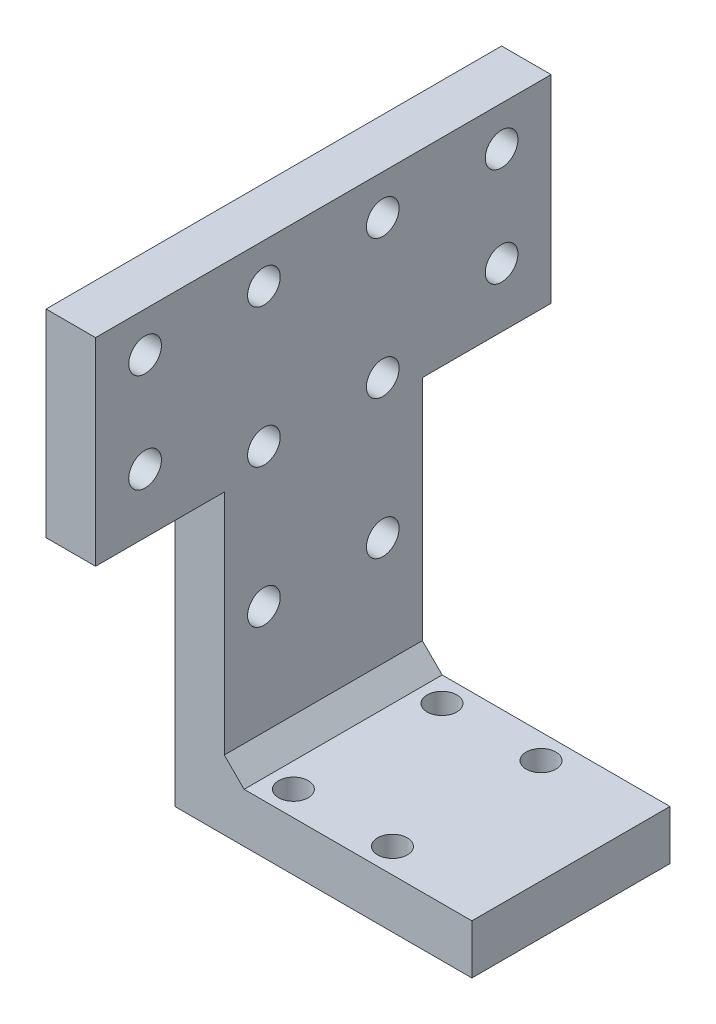
ISO-10303-21;
HEADER;
FILE_DESCRIPTION(('STEP AP214'),'2;1');
FILE_NAME('part.step','',(''),(''),'','','');
FILE_SCHEMA(('AUTOMOTIVE_DESIGN { 1 0 10303 214 1 1 1 1 }'));
ENDSEC;
DATA;
#1=APPLICATION_CONTEXT('core data for automotive mechanical design processes');
#2=APPLICATION_PROTOCOL_DEFINITION('international standard','automotive_design',2000,#1);
#3=PRODUCT_CONTEXT('',#1,'mechanical');
#4=PRODUCT('Part','Part','',(#3));
#5=PRODUCT_RELATED_PRODUCT_CATEGORY('part','',(#4));
#6=PRODUCT_DEFINITION_FORMATION('','',#4);
#7=PRODUCT_DEFINITION_CONTEXT('part definition',#1,'design');
#8=PRODUCT_DEFINITION('design','',#6,#7);
#9=PRODUCT_DEFINITION_SHAPE('','',#8);
#10=(LENGTH_UNIT() NAMED_UNIT(*) SI_UNIT(.MILLI.,.METRE.));
#11=(NAMED_UNIT(*) PLANE_ANGLE_UNIT() SI_UNIT($,.RADIAN.));
#12=(NAMED_UNIT(*) SI_UNIT($,.STERADIAN.) SOLID_ANGLE_UNIT());
#13=UNCERTAINTY_MEASURE_WITH_UNIT(LENGTH_MEASURE(1.E-05),#10,'distance_accuracy_value','');
#14=(GEOMETRIC_REPRESENTATION_CONTEXT(3) GLOBAL_UNCERTAINTY_ASSIGNED_CONTEXT((#13)) GLOBAL_UNIT_ASSIGNED_CONTEXT((#10,
#11,#12)) REPRESENTATION_CONTEXT('',''));
#15=CARTESIAN_POINT('',(0.,0.,0.));
#16=DIRECTION('',(0.,0.,1.));
#17=DIRECTION('',(1.,0.,0.));
#18=AXIS2_PLACEMENT_3D('',#15,#16,#17);
#19=CARTESIAN_POINT('',(0.,0.,0.));
#20=DIRECTION('',(0.,0.,1.));
#21=DIRECTION('',(1.,0.,0.));
#22=AXIS2_PLACEMENT_3D('',#19,#20,#21);
#23=PLANE('',#22);
#24=DIRECTION('',(-1.,0.,0.));
#25=VECTOR('',#24,1.);
#26=CARTESIAN_POINT('',(5.,30.,0.));
#27=LINE('',#26,#25);
#28=CARTESIAN_POINT('',(5.,30.,0.));
#29=VERTEX_POINT('',#28);
#30=CARTESIAN_POINT('',(0.,30.,0.));
#31=VERTEX_POINT('',#30);
#32=EDGE_CURVE('E50',#29,#31,#27,.T.);
#33=ORIENTED_EDGE('',*,*,#32,.F.);
#34=DIRECTION('',(0.,1.,0.));
#35=VECTOR('',#34,1.);
#36=CARTESIAN_POINT('',(5.,7.,0.));
#37=LINE('',#36,#35);
#38=CARTESIAN_POINT('',(5.,7.,0.));
#39=VERTEX_POINT('',#38);
#40=EDGE_CURVE('E210',#39,#29,#37,.T.);
#41=ORIENTED_EDGE('',*,*,#40,.F.);
#42=DIRECTION('',(-0.707106781186551,0.707106781186543,0.));
#43=VECTOR('',#42,1.);
#44=CARTESIAN_POINT('',(5.,7.,0.));
#45=LINE('',#44,#43);
#46=CARTESIAN_POINT('',(7.00000000000002,5.,0.));
#47=VERTEX_POINT('',#46);
#48=EDGE_CURVE('E227',#47,#39,#45,.T.);
#49=ORIENTED_EDGE('',*,*,#48,.F.);
#50=DIRECTION('',(-1.,0.,0.));
#51=VECTOR('',#50,1.);
#52=CARTESIAN_POINT('',(30.,5.,0.));
#53=LINE('',#52,#51);
#54=CARTESIAN_POINT('',(30.,5.,0.));
#55=VERTEX_POINT('',#54);
#56=EDGE_CURVE('E225',#55,#47,#53,.T.);
#57=ORIENTED_EDGE('',*,*,#56,.F.);
#58=DIRECTION('',(0.,1.,0.));
#59=VECTOR('',#58,1.);
#60=CARTESIAN_POINT('',(30.,0.,0.));
#61=LINE('',#60,#59);
#62=CARTESIAN_POINT('',(30.,0.,0.));
#63=VERTEX_POINT('',#62);
#64=EDGE_CURVE('E223',#63,#55,#61,.T.);
#65=ORIENTED_EDGE('',*,*,#64,.F.);
#66=DIRECTION('',(1.,0.,0.));
#67=VECTOR('',#66,1.);
#68=CARTESIAN_POINT('',(0.,0.,0.));
#69=LINE('',#68,#67);
#70=CARTESIAN_POINT('',(0.,0.,0.));
#71=VERTEX_POINT('',#70);
#72=EDGE_CURVE('E221',#71,#63,#69,.T.);
#73=ORIENTED_EDGE('',*,*,#72,.F.);
#74=DIRECTION('',(0.,-1.,0.));
#75=VECTOR('',#74,1.);
#76=CARTESIAN_POINT('',(0.,50.,0.));
#77=LINE('',#76,#75);
#78=EDGE_CURVE('E204',#31,#71,#77,.T.);
#79=ORIENTED_EDGE('',*,*,#78,.F.);
#80=EDGE_LOOP('',(#33,#41,#49,#57,#65,#73,#79));
#81=FACE_BOUND('',#80,.T.);
#82=ADVANCED_FACE('F33',(#81),#23,.F.);
#83=CARTESIAN_POINT('',(0.,0.,20.));
#84=DIRECTION('',(0.,0.,1.));
#85=DIRECTION('',(1.,0.,0.));
#86=AXIS2_PLACEMENT_3D('',#83,#84,#85);
#87=PLANE('',#86);
#88=DIRECTION('',(0.,1.,0.));
#89=VECTOR('',#88,1.);
#90=CARTESIAN_POINT('',(5.,7.,20.));
#91=LINE('',#90,#89);
#92=CARTESIAN_POINT('',(5.,7.,20.));
#93=VERTEX_POINT('',#92);
#94=CARTESIAN_POINT('',(5.,30.,20.));
#95=VERTEX_POINT('',#94);
#96=EDGE_CURVE('E129',#93,#95,#91,.T.);
#97=ORIENTED_EDGE('',*,*,#96,.T.);
#98=DIRECTION('',(-1.,0.,0.));
#99=VECTOR('',#98,1.);
#100=CARTESIAN_POINT('',(5.,30.,20.));
#101=LINE('',#100,#99);
#102=CARTESIAN_POINT('',(0.,30.,20.));
#103=VERTEX_POINT('',#102);
#104=EDGE_CURVE('E162',#95,#103,#101,.T.);
#105=ORIENTED_EDGE('',*,*,#104,.T.);
#106=DIRECTION('',(0.,-1.,0.));
#107=VECTOR('',#106,1.);
#108=CARTESIAN_POINT('',(0.,50.,20.));
#109=LINE('',#108,#107);
#110=CARTESIAN_POINT('',(0.,0.,20.));
#111=VERTEX_POINT('',#110);
#112=EDGE_CURVE('E207',#103,#111,#109,.T.);
#113=ORIENTED_EDGE('',*,*,#112,.T.);
#114=DIRECTION('',(1.,0.,0.));
#115=VECTOR('',#114,1.);
#116=CARTESIAN_POINT('',(0.,0.,20.));
#117=LINE('',#116,#115);
#118=CARTESIAN_POINT('',(30.,0.,20.));
#119=VERTEX_POINT('',#118);
#120=EDGE_CURVE('E209',#111,#119,#117,.T.);
#121=ORIENTED_EDGE('',*,*,#120,.T.);
#122=DIRECTION('',(0.,1.,0.));
#123=VECTOR('',#122,1.);
#124=CARTESIAN_POINT('',(30.,0.,20.));
#125=LINE('',#124,#123);
#126=CARTESIAN_POINT('',(30.,5.,20.));
#127=VERTEX_POINT('',#126);
#128=EDGE_CURVE('E212',#119,#127,#125,.T.);
#129=ORIENTED_EDGE('',*,*,#128,.T.);
#130=DIRECTION('',(-1.,0.,0.));
#131=VECTOR('',#130,1.);
#132=CARTESIAN_POINT('',(30.,5.,20.));
#133=LINE('',#132,#131);
#134=CARTESIAN_POINT('',(7.00000000000002,5.,20.));
#135=VERTEX_POINT('',#134);
#136=EDGE_CURVE('E214',#127,#135,#133,.T.);
#137=ORIENTED_EDGE('',*,*,#136,.T.);
#138=DIRECTION('',(-0.707106781186551,0.707106781186543,0.));
#139=VECTOR('',#138,1.);
#140=CARTESIAN_POINT('',(5.,7.,20.));
#141=LINE('',#140,#139);
#142=EDGE_CURVE('E216',#135,#93,#141,.T.);
#143=ORIENTED_EDGE('',*,*,#142,.T.);
#144=EDGE_LOOP('',(#97,#105,#113,#121,#129,#137,#143));
#145=FACE_BOUND('',#144,.T.);
#146=ADVANCED_FACE('F326',(#145),#87,.T.);
#147=CARTESIAN_POINT('',(5.,50.,20.));
#148=DIRECTION('',(0.,-1.,0.));
#149=DIRECTION('',(0.,0.,-1.));
#150=AXIS2_PLACEMENT_3D('',#147,#148,#149);
#151=PLANE('',#150);
#152=DIRECTION('',(0.,0.,-1.));
#153=VECTOR('',#152,1.);
#154=CARTESIAN_POINT('',(5.,50.,20.));
#155=LINE('',#154,#153);
#156=CARTESIAN_POINT('',(5.,50.,33.));
#157=VERTEX_POINT('',#156);
#158=CARTESIAN_POINT('',(5.,50.,-13.));
#159=VERTEX_POINT('',#158);
#160=EDGE_CURVE('E118',#157,#159,#155,.T.);
#161=ORIENTED_EDGE('',*,*,#160,.T.);
#162=DIRECTION('',(-1.,0.,0.));
#163=VECTOR('',#162,1.);
#164=CARTESIAN_POINT('',(5.,50.,-13.));
#165=LINE('',#164,#163);
#166=CARTESIAN_POINT('',(0.,50.,-13.));
#167=VERTEX_POINT('',#166);
#168=EDGE_CURVE('E120',#159,#167,#165,.T.);
#169=ORIENTED_EDGE('',*,*,#168,.T.);
#170=DIRECTION('',(0.,0.,-1.));
#171=VECTOR('',#170,1.);
#172=CARTESIAN_POINT('',(0.,50.,20.));
#173=LINE('',#172,#171);
#174=CARTESIAN_POINT('',(0.,50.,33.));
#175=VERTEX_POINT('',#174);
#176=EDGE_CURVE('E11',#175,#167,#173,.T.);
#177=ORIENTED_EDGE('',*,*,#176,.F.);
#178=DIRECTION('',(-1.,0.,0.));
#179=VECTOR('',#178,1.);
#180=CARTESIAN_POINT('',(5.,50.,33.));
#181=LINE('',#180,#179);
#182=EDGE_CURVE('E123',#157,#175,#181,.T.);
#183=ORIENTED_EDGE('',*,*,#182,.F.);
#184=EDGE_LOOP('',(#161,#169,#177,#183));
#185=FACE_BOUND('',#184,.T.);
#186=ADVANCED_FACE('F35',(#185),#151,.F.);
#187=CARTESIAN_POINT('',(0.,50.,20.));
#188=DIRECTION('',(1.,0.,0.));
#189=DIRECTION('',(0.,1.,0.));
#190=AXIS2_PLACEMENT_3D('',#187,#188,#189);
#191=PLANE('',#190);
#192=CARTESIAN_POINT('',(0.,36.,28.));
#193=DIRECTION('',(1.,0.,0.));
#194=DIRECTION('',(0.,1.,0.));
#195=AXIS2_PLACEMENT_3D('',#192,#193,#194);
#196=CIRCLE('',#195,1.65);
#197=CARTESIAN_POINT('',(0.,37.65,28.));
#198=VERTEX_POINT('',#197);
#199=EDGE_CURVE('E274',#198,#198,#196,.T.);
#200=ORIENTED_EDGE('',*,*,#199,.T.);
#201=EDGE_LOOP('',(#200));
#202=FACE_BOUND('',#201,.T.);
#203=CARTESIAN_POINT('',(0.,46.,-8.));
#204=DIRECTION('',(1.,0.,0.));
#205=DIRECTION('',(0.,1.,0.));
#206=AXIS2_PLACEMENT_3D('',#203,#204,#205);
#207=CIRCLE('',#206,1.65);
#208=CARTESIAN_POINT('',(0.,47.65,-8.));
#209=VERTEX_POINT('',#208);
#210=EDGE_CURVE('E269',#209,#209,#207,.T.);
#211=ORIENTED_EDGE('',*,*,#210,.T.);
#212=EDGE_LOOP('',(#211));
#213=FACE_BOUND('',#212,.T.);
#214=CARTESIAN_POINT('',(0.,36.,-8.));
#215=DIRECTION('',(1.,0.,0.));
#216=DIRECTION('',(0.,1.,0.));
#217=AXIS2_PLACEMENT_3D('',#214,#215,#216);
#218=CIRCLE('',#217,1.65);
#219=CARTESIAN_POINT('',(0.,37.65,-8.));
#220=VERTEX_POINT('',#219);
#221=EDGE_CURVE('E265',#220,#220,#218,.T.);
#222=ORIENTED_EDGE('',*,*,#221,.T.);
#223=EDGE_LOOP('',(#222));
#224=FACE_BOUND('',#223,.T.);
#225=CARTESIAN_POINT('',(0.,46.,28.));
#226=DIRECTION('',(1.,0.,0.));
#227=DIRECTION('',(0.,1.,0.));
#228=AXIS2_PLACEMENT_3D('',#225,#226,#227);
#229=CIRCLE('',#228,1.65);
#230=CARTESIAN_POINT('',(0.,47.65,28.));
#231=VERTEX_POINT('',#230);
#232=EDGE_CURVE('E149',#231,#231,#229,.T.);
#233=ORIENTED_EDGE('',*,*,#232,.T.);
#234=EDGE_LOOP('',(#233));
#235=FACE_BOUND('',#234,.T.);
#236=CARTESIAN_POINT('',(0.,18.,16.));
#237=DIRECTION('',(1.,0.,0.));
#238=DIRECTION('',(0.,1.,0.));
#239=AXIS2_PLACEMENT_3D('',#236,#237,#238);
#240=CIRCLE('',#239,1.65);
#241=CARTESIAN_POINT('',(0.,19.65,16.));
#242=VERTEX_POINT('',#241);
#243=EDGE_CURVE('E184',#242,#242,#240,.T.);
#244=ORIENTED_EDGE('',*,*,#243,.T.);
#245=EDGE_LOOP('',(#244));
#246=FACE_BOUND('',#245,.T.);
#247=CARTESIAN_POINT('',(0.,32.,16.));
#248=DIRECTION('',(1.,0.,0.));
#249=DIRECTION('',(0.,1.,0.));
#250=AXIS2_PLACEMENT_3D('',#247,#248,#249);
#251=CIRCLE('',#250,1.65);
#252=CARTESIAN_POINT('',(0.,33.65,16.));
#253=VERTEX_POINT('',#252);
#254=EDGE_CURVE('E177',#253,#253,#251,.T.);
#255=ORIENTED_EDGE('',*,*,#254,.T.);
#256=EDGE_LOOP('',(#255));
#257=FACE_BOUND('',#256,.T.);
#258=CARTESIAN_POINT('',(0.,32.,4.));
#259=DIRECTION('',(1.,0.,0.));
#260=DIRECTION('',(0.,1.,0.));
#261=AXIS2_PLACEMENT_3D('',#258,#259,#260);
#262=CIRCLE('',#261,1.65);
#263=CARTESIAN_POINT('',(0.,33.65,4.));
#264=VERTEX_POINT('',#263);
#265=EDGE_CURVE('E196',#264,#264,#262,.T.);
#266=ORIENTED_EDGE('',*,*,#265,.T.);
#267=EDGE_LOOP('',(#266));
#268=FACE_BOUND('',#267,.T.);
#269=CARTESIAN_POINT('',(0.,46.,16.));
#270=DIRECTION('',(1.,0.,0.));
#271=DIRECTION('',(0.,1.,0.));
#272=AXIS2_PLACEMENT_3D('',#269,#270,#271);
#273=CIRCLE('',#272,1.65);
#274=CARTESIAN_POINT('',(0.,47.65,16.));
#275=VERTEX_POINT('',#274);
#276=EDGE_CURVE('E189',#275,#275,#273,.T.);
#277=ORIENTED_EDGE('',*,*,#276,.T.);
#278=EDGE_LOOP('',(#277));
#279=FACE_BOUND('',#278,.T.);
#280=CARTESIAN_POINT('',(0.,18.,4.));
#281=DIRECTION('',(1.,0.,0.));
#282=DIRECTION('',(0.,1.,0.));
#283=AXIS2_PLACEMENT_3D('',#280,#281,#282);
#284=CIRCLE('',#283,1.65);
#285=CARTESIAN_POINT('',(0.,19.65,4.));
#286=VERTEX_POINT('',#285);
#287=EDGE_CURVE('E171',#286,#286,#284,.T.);
#288=ORIENTED_EDGE('',*,*,#287,.T.);
#289=EDGE_LOOP('',(#288));
#290=FACE_BOUND('',#289,.T.);
#291=CARTESIAN_POINT('',(0.,46.,4.));
#292=DIRECTION('',(1.,0.,0.));
#293=DIRECTION('',(0.,1.,0.));
#294=AXIS2_PLACEMENT_3D('',#291,#292,#293);
#295=CIRCLE('',#294,1.65);
#296=CARTESIAN_POINT('',(0.,47.65,4.));
#297=VERTEX_POINT('',#296);
#298=EDGE_CURVE('E201',#297,#297,#295,.T.);
#299=ORIENTED_EDGE('',*,*,#298,.T.);
#300=EDGE_LOOP('',(#299));
#301=FACE_BOUND('',#300,.T.);
#302=ORIENTED_EDGE('',*,*,#176,.T.);
#303=DIRECTION('',(0.,-1.,0.));
#304=VECTOR('',#303,1.);
#305=CARTESIAN_POINT('',(0.,50.,-13.));
#306=LINE('',#305,#304);
#307=CARTESIAN_POINT('',(0.,30.,-13.));
#308=VERTEX_POINT('',#307);
#309=EDGE_CURVE('E137',#167,#308,#306,.T.);
#310=ORIENTED_EDGE('',*,*,#309,.T.);
#311=DIRECTION('',(0.,0.,1.));
#312=VECTOR('',#311,1.);
#313=CARTESIAN_POINT('',(0.,30.,-13.));
#314=LINE('',#313,#312);
#315=EDGE_CURVE('E143',#308,#31,#314,.T.);
#316=ORIENTED_EDGE('',*,*,#315,.T.);
#317=ORIENTED_EDGE('',*,*,#78,.T.);
#318=DIRECTION('',(0.,0.,-1.));
#319=VECTOR('',#318,1.);
#320=CARTESIAN_POINT('',(0.,0.,20.));
#321=LINE('',#320,#319);
#322=EDGE_CURVE('E42',#111,#71,#321,.T.);
#323=ORIENTED_EDGE('',*,*,#322,.F.);
#324=ORIENTED_EDGE('',*,*,#112,.F.);
#325=DIRECTION('',(0.,0.,1.));
#326=VECTOR('',#325,1.);
#327=CARTESIAN_POINT('',(0.,30.,33.));
#328=LINE('',#327,#326);
#329=CARTESIAN_POINT('',(0.,30.,33.));
#330=VERTEX_POINT('',#329);
#331=EDGE_CURVE('E58',#103,#330,#328,.T.);
#332=ORIENTED_EDGE('',*,*,#331,.T.);
#333=DIRECTION('',(0.,1.,0.));
#334=VECTOR('',#333,1.);
#335=CARTESIAN_POINT('',(0.,50.,33.));
#336=LINE('',#335,#334);
#337=EDGE_CURVE('E160',#330,#175,#336,.T.);
#338=ORIENTED_EDGE('',*,*,#337,.T.);
#339=EDGE_LOOP('',(#302,#310,#316,#317,#323,#324,#332,#338));
#340=FACE_BOUND('',#339,.T.);
#341=ADVANCED_FACE('F284',(#202,#213,#224,#235,#246,#257,#268,#279,#290,#301,#340),#191,.F.);
#342=CARTESIAN_POINT('',(0.,0.,20.));
#343=DIRECTION('',(0.,1.,0.));
#344=DIRECTION('',(0.,0.,1.));
#345=AXIS2_PLACEMENT_3D('',#342,#343,#344);
#346=PLANE('',#345);
#347=CARTESIAN_POINT('',(9.47999999999995,0.,2.50000000000002));
#348=DIRECTION('',(0.,1.,0.));
#349=DIRECTION('',(-1.,0.,0.));
#350=AXIS2_PLACEMENT_3D('',#347,#348,#349);
#351=CIRCLE('',#350,1.50000000000003);
#352=CARTESIAN_POINT('',(7.97999999999992,0.,2.50000000000002));
#353=VERTEX_POINT('',#352);
#354=EDGE_CURVE('E543',#353,#353,#351,.T.);
#355=ORIENTED_EDGE('',*,*,#354,.T.);
#356=EDGE_LOOP('',(#355));
#357=FACE_BOUND('',#356,.T.);
#358=CARTESIAN_POINT('',(19.4799999999999,0.,2.50000000000002));
#359=DIRECTION('',(0.,1.,0.));
#360=DIRECTION('',(-1.,0.,0.));
#361=AXIS2_PLACEMENT_3D('',#358,#359,#360);
#362=CIRCLE('',#361,1.50000000000002);
#363=CARTESIAN_POINT('',(17.9799999999999,0.,2.50000000000002));
#364=VERTEX_POINT('',#363);
#365=EDGE_CURVE('E544',#364,#364,#362,.T.);
#366=ORIENTED_EDGE('',*,*,#365,.T.);
#367=EDGE_LOOP('',(#366));
#368=FACE_BOUND('',#367,.T.);
#369=CARTESIAN_POINT('',(19.4799999999999,0.,17.5));
#370=DIRECTION('',(0.,1.,0.));
#371=DIRECTION('',(-1.,0.,0.));
#372=AXIS2_PLACEMENT_3D('',#369,#370,#371);
#373=CIRCLE('',#372,1.50000000000002);
#374=CARTESIAN_POINT('',(17.9799999999999,0.,17.5));
#375=VERTEX_POINT('',#374);
#376=EDGE_CURVE('E546',#375,#375,#373,.T.);
#377=ORIENTED_EDGE('',*,*,#376,.T.);
#378=EDGE_LOOP('',(#377));
#379=FACE_BOUND('',#378,.T.);
#380=CARTESIAN_POINT('',(9.47999999999995,0.,17.5));
#381=DIRECTION('',(0.,1.,0.));
#382=DIRECTION('',(-1.,0.,0.));
#383=AXIS2_PLACEMENT_3D('',#380,#381,#382);
#384=CIRCLE('',#383,1.50000000000003);
#385=CARTESIAN_POINT('',(7.97999999999992,0.,17.5));
#386=VERTEX_POINT('',#385);
#387=EDGE_CURVE('E258',#386,#386,#384,.T.);
#388=ORIENTED_EDGE('',*,*,#387,.T.);
#389=EDGE_LOOP('',(#388));
#390=FACE_BOUND('',#389,.T.);
#391=ORIENTED_EDGE('',*,*,#72,.T.);
#392=DIRECTION('',(0.,0.,-1.));
#393=VECTOR('',#392,1.);
#394=CARTESIAN_POINT('',(30.,0.,20.));
#395=LINE('',#394,#393);
#396=EDGE_CURVE('E238',#119,#63,#395,.T.);
#397=ORIENTED_EDGE('',*,*,#396,.F.);
#398=ORIENTED_EDGE('',*,*,#120,.F.);
#399=ORIENTED_EDGE('',*,*,#322,.T.);
#400=EDGE_LOOP('',(#391,#397,#398,#399));
#401=FACE_BOUND('',#400,.T.);
#402=ADVANCED_FACE('F342',(#357,#368,#379,#390,#401),#346,.F.);
#403=CARTESIAN_POINT('',(30.,0.,20.));
#404=DIRECTION('',(-1.,0.,0.));
#405=DIRECTION('',(0.,0.,1.));
#406=AXIS2_PLACEMENT_3D('',#403,#404,#405);
#407=PLANE('',#406);
#408=ORIENTED_EDGE('',*,*,#64,.T.);
#409=DIRECTION('',(0.,0.,-1.));
#410=VECTOR('',#409,1.);
#411=CARTESIAN_POINT('',(30.,5.,20.));
#412=LINE('',#411,#410);
#413=EDGE_CURVE('E235',#127,#55,#412,.T.);
#414=ORIENTED_EDGE('',*,*,#413,.F.);
#415=ORIENTED_EDGE('',*,*,#128,.F.);
#416=ORIENTED_EDGE('',*,*,#396,.T.);
#417=EDGE_LOOP('',(#408,#414,#415,#416));
#418=FACE_BOUND('',#417,.T.);
#419=ADVANCED_FACE('F339',(#418),#407,.F.);
#420=CARTESIAN_POINT('',(30.,5.,20.));
#421=DIRECTION('',(0.,-1.,0.));
#422=DIRECTION('',(1.,0.,0.));
#423=AXIS2_PLACEMENT_3D('',#420,#421,#422);
#424=PLANE('',#423);
#425=CARTESIAN_POINT('',(9.47999999999995,5.,2.50000000000002));
#426=DIRECTION('',(0.,-1.,0.));
#427=DIRECTION('',(1.,0.,0.));
#428=AXIS2_PLACEMENT_3D('',#425,#426,#427);
#429=CIRCLE('',#428,1.50000000000003);
#430=CARTESIAN_POINT('',(10.98,5.,2.50000000000002));
#431=VERTEX_POINT('',#430);
#432=EDGE_CURVE('E37',#431,#431,#429,.T.);
#433=ORIENTED_EDGE('',*,*,#432,.T.);
#434=EDGE_LOOP('',(#433));
#435=FACE_BOUND('',#434,.T.);
#436=CARTESIAN_POINT('',(19.4799999999999,5.,2.50000000000002));
#437=DIRECTION('',(0.,-1.,0.));
#438=DIRECTION('',(1.,0.,0.));
#439=AXIS2_PLACEMENT_3D('',#436,#437,#438);
#440=CIRCLE('',#439,1.50000000000002);
#441=CARTESIAN_POINT('',(20.98,5.,2.50000000000002));
#442=VERTEX_POINT('',#441);
#443=EDGE_CURVE('E260',#442,#442,#440,.T.);
#444=ORIENTED_EDGE('',*,*,#443,.T.);
#445=EDGE_LOOP('',(#444));
#446=FACE_BOUND('',#445,.T.);
#447=CARTESIAN_POINT('',(19.4799999999999,5.,17.5));
#448=DIRECTION('',(0.,-1.,0.));
#449=DIRECTION('',(1.,0.,0.));
#450=AXIS2_PLACEMENT_3D('',#447,#448,#449);
#451=CIRCLE('',#450,1.50000000000002);
#452=CARTESIAN_POINT('',(20.98,5.,17.5));
#453=VERTEX_POINT('',#452);
#454=EDGE_CURVE('E257',#453,#453,#451,.T.);
#455=ORIENTED_EDGE('',*,*,#454,.T.);
#456=EDGE_LOOP('',(#455));
#457=FACE_BOUND('',#456,.T.);
#458=CARTESIAN_POINT('',(9.47999999999995,5.,17.5));
#459=DIRECTION('',(0.,-1.,0.));
#460=DIRECTION('',(1.,0.,0.));
#461=AXIS2_PLACEMENT_3D('',#458,#459,#460);
#462=CIRCLE('',#461,1.50000000000003);
#463=CARTESIAN_POINT('',(10.98,5.,17.5));
#464=VERTEX_POINT('',#463);
#465=EDGE_CURVE('E254',#464,#464,#462,.T.);
#466=ORIENTED_EDGE('',*,*,#465,.T.);
#467=EDGE_LOOP('',(#466));
#468=FACE_BOUND('',#467,.T.);
#469=ORIENTED_EDGE('',*,*,#56,.T.);
#470=DIRECTION('',(0.,0.,-1.));
#471=VECTOR('',#470,1.);
#472=CARTESIAN_POINT('',(7.00000000000002,5.,20.));
#473=LINE('',#472,#471);
#474=EDGE_CURVE('E232',#135,#47,#473,.T.);
#475=ORIENTED_EDGE('',*,*,#474,.F.);
#476=ORIENTED_EDGE('',*,*,#136,.F.);
#477=ORIENTED_EDGE('',*,*,#413,.T.);
#478=EDGE_LOOP('',(#469,#475,#476,#477));
#479=FACE_BOUND('',#478,.T.);
#480=ADVANCED_FACE('F335',(#435,#446,#457,#468,#479),#424,.F.);
#481=CARTESIAN_POINT('',(5.,7.,20.));
#482=DIRECTION('',(-0.707106781186544,-0.707106781186552,0.));
#483=DIRECTION('',(0.707106781186552,-0.707106781186544,0.));
#484=AXIS2_PLACEMENT_3D('',#481,#482,#483);
#485=PLANE('',#484);
#486=ORIENTED_EDGE('',*,*,#48,.T.);
#487=DIRECTION('',(0.,0.,-1.));
#488=VECTOR('',#487,1.);
#489=CARTESIAN_POINT('',(5.,7.,20.));
#490=LINE('',#489,#488);
#491=EDGE_CURVE('E128',#93,#39,#490,.T.);
#492=ORIENTED_EDGE('',*,*,#491,.F.);
#493=ORIENTED_EDGE('',*,*,#142,.F.);
#494=ORIENTED_EDGE('',*,*,#474,.T.);
#495=EDGE_LOOP('',(#486,#492,#493,#494));
#496=FACE_BOUND('',#495,.T.);
#497=ADVANCED_FACE('F297',(#496),#485,.F.);
#498=CARTESIAN_POINT('',(5.,7.,20.));
#499=DIRECTION('',(-1.,0.,0.));
#500=DIRECTION('',(0.,-1.,0.));
#501=AXIS2_PLACEMENT_3D('',#498,#499,#500);
#502=PLANE('',#501);
#503=CARTESIAN_POINT('',(5.,36.,28.));
#504=DIRECTION('',(-1.,0.,0.));
#505=DIRECTION('',(0.,-1.,0.));
#506=AXIS2_PLACEMENT_3D('',#503,#504,#505);
#507=CIRCLE('',#506,1.65);
#508=CARTESIAN_POINT('',(5.,34.35,28.));
#509=VERTEX_POINT('',#508);
#510=EDGE_CURVE('E152',#509,#509,#507,.T.);
#511=ORIENTED_EDGE('',*,*,#510,.T.);
#512=EDGE_LOOP('',(#511));
#513=FACE_BOUND('',#512,.T.);
#514=CARTESIAN_POINT('',(5.,46.,-8.));
#515=DIRECTION('',(-1.,0.,0.));
#516=DIRECTION('',(0.,-1.,0.));
#517=AXIS2_PLACEMENT_3D('',#514,#515,#516);
#518=CIRCLE('',#517,1.65);
#519=CARTESIAN_POINT('',(5.,44.35,-8.));
#520=VERTEX_POINT('',#519);
#521=EDGE_CURVE('E249',#520,#520,#518,.T.);
#522=ORIENTED_EDGE('',*,*,#521,.T.);
#523=EDGE_LOOP('',(#522));
#524=FACE_BOUND('',#523,.T.);
#525=CARTESIAN_POINT('',(5.,36.,-8.));
#526=DIRECTION('',(-1.,0.,0.));
#527=DIRECTION('',(0.,-1.,0.));
#528=AXIS2_PLACEMENT_3D('',#525,#526,#527);
#529=CIRCLE('',#528,1.65);
#530=CARTESIAN_POINT('',(5.,34.35,-8.));
#531=VERTEX_POINT('',#530);
#532=EDGE_CURVE('E246',#531,#531,#529,.T.);
#533=ORIENTED_EDGE('',*,*,#532,.T.);
#534=EDGE_LOOP('',(#533));
#535=FACE_BOUND('',#534,.T.);
#536=CARTESIAN_POINT('',(5.,46.,28.));
#537=DIRECTION('',(-1.,0.,0.));
#538=DIRECTION('',(0.,-1.,0.));
#539=AXIS2_PLACEMENT_3D('',#536,#537,#538);
#540=CIRCLE('',#539,1.65);
#541=CARTESIAN_POINT('',(5.,44.35,28.));
#542=VERTEX_POINT('',#541);
#543=EDGE_CURVE('E243',#542,#542,#540,.T.);
#544=ORIENTED_EDGE('',*,*,#543,.T.);
#545=EDGE_LOOP('',(#544));
#546=FACE_BOUND('',#545,.T.);
#547=CARTESIAN_POINT('',(5.,18.,16.));
#548=DIRECTION('',(1.,0.,0.));
#549=DIRECTION('',(0.,1.,0.));
#550=AXIS2_PLACEMENT_3D('',#547,#548,#549);
#551=CIRCLE('',#550,1.65);
#552=CARTESIAN_POINT('',(5.,19.65,16.));
#553=VERTEX_POINT('',#552);
#554=EDGE_CURVE('E174',#553,#553,#551,.T.);
#555=ORIENTED_EDGE('',*,*,#554,.F.);
#556=EDGE_LOOP('',(#555));
#557=FACE_BOUND('',#556,.T.);
#558=CARTESIAN_POINT('',(5.,32.,16.));
#559=DIRECTION('',(1.,0.,0.));
#560=DIRECTION('',(0.,1.,0.));
#561=AXIS2_PLACEMENT_3D('',#558,#559,#560);
#562=CIRCLE('',#561,1.65);
#563=CARTESIAN_POINT('',(5.,33.65,16.));
#564=VERTEX_POINT('',#563);
#565=EDGE_CURVE('E181',#564,#564,#562,.T.);
#566=ORIENTED_EDGE('',*,*,#565,.F.);
#567=EDGE_LOOP('',(#566));
#568=FACE_BOUND('',#567,.T.);
#569=CARTESIAN_POINT('',(5.,32.,4.));
#570=DIRECTION('',(1.,0.,0.));
#571=DIRECTION('',(0.,1.,0.));
#572=AXIS2_PLACEMENT_3D('',#569,#570,#571);
#573=CIRCLE('',#572,1.65);
#574=CARTESIAN_POINT('',(5.,33.65,4.));
#575=VERTEX_POINT('',#574);
#576=EDGE_CURVE('E180',#575,#575,#573,.T.);
#577=ORIENTED_EDGE('',*,*,#576,.F.);
#578=EDGE_LOOP('',(#577));
#579=FACE_BOUND('',#578,.T.);
#580=CARTESIAN_POINT('',(5.,46.,16.));
#581=DIRECTION('',(1.,0.,0.));
#582=DIRECTION('',(0.,1.,0.));
#583=AXIS2_PLACEMENT_3D('',#580,#581,#582);
#584=CIRCLE('',#583,1.65);
#585=CARTESIAN_POINT('',(5.,47.65,16.));
#586=VERTEX_POINT('',#585);
#587=EDGE_CURVE('E193',#586,#586,#584,.T.);
#588=ORIENTED_EDGE('',*,*,#587,.F.);
#589=EDGE_LOOP('',(#588));
#590=FACE_BOUND('',#589,.T.);
#591=CARTESIAN_POINT('',(5.,18.,4.));
#592=DIRECTION('',(1.,0.,0.));
#593=DIRECTION('',(0.,1.,0.));
#594=AXIS2_PLACEMENT_3D('',#591,#592,#593);
#595=CIRCLE('',#594,1.65);
#596=CARTESIAN_POINT('',(5.,19.65,4.));
#597=VERTEX_POINT('',#596);
#598=EDGE_CURVE('E167',#597,#597,#595,.T.);
#599=ORIENTED_EDGE('',*,*,#598,.F.);
#600=EDGE_LOOP('',(#599));
#601=FACE_BOUND('',#600,.T.);
#602=CARTESIAN_POINT('',(5.,46.,4.));
#603=DIRECTION('',(1.,0.,0.));
#604=DIRECTION('',(0.,1.,0.));
#605=AXIS2_PLACEMENT_3D('',#602,#603,#604);
#606=CIRCLE('',#605,1.65);
#607=CARTESIAN_POINT('',(5.,47.65,4.));
#608=VERTEX_POINT('',#607);
#609=EDGE_CURVE('E192',#608,#608,#606,.T.);
#610=ORIENTED_EDGE('',*,*,#609,.F.);
#611=EDGE_LOOP('',(#610));
#612=FACE_BOUND('',#611,.T.);
#613=ORIENTED_EDGE('',*,*,#40,.T.);
#614=DIRECTION('',(0.,0.,1.));
#615=VECTOR('',#614,1.);
#616=CARTESIAN_POINT('',(5.,30.,-13.));
#617=LINE('',#616,#615);
#618=CARTESIAN_POINT('',(5.,30.,-13.));
#619=VERTEX_POINT('',#618);
#620=EDGE_CURVE('E139',#619,#29,#617,.T.);
#621=ORIENTED_EDGE('',*,*,#620,.F.);
#622=DIRECTION('',(0.,-1.,0.));
#623=VECTOR('',#622,1.);
#624=CARTESIAN_POINT('',(5.,50.,-13.));
#625=LINE('',#624,#623);
#626=EDGE_CURVE('E134',#159,#619,#625,.T.);
#627=ORIENTED_EDGE('',*,*,#626,.F.);
#628=ORIENTED_EDGE('',*,*,#160,.F.);
#629=DIRECTION('',(0.,1.,0.));
#630=VECTOR('',#629,1.);
#631=CARTESIAN_POINT('',(5.,50.,33.));
#632=LINE('',#631,#630);
#633=CARTESIAN_POINT('',(5.,30.,33.));
#634=VERTEX_POINT('',#633);
#635=EDGE_CURVE('E159',#634,#157,#632,.T.);
#636=ORIENTED_EDGE('',*,*,#635,.F.);
#637=DIRECTION('',(0.,0.,1.));
#638=VECTOR('',#637,1.);
#639=CARTESIAN_POINT('',(5.,30.,33.));
#640=LINE('',#639,#638);
#641=EDGE_CURVE('E156',#95,#634,#640,.T.);
#642=ORIENTED_EDGE('',*,*,#641,.F.);
#643=ORIENTED_EDGE('',*,*,#96,.F.);
#644=ORIENTED_EDGE('',*,*,#491,.T.);
#645=EDGE_LOOP('',(#613,#621,#627,#628,#636,#642,#643,#644));
#646=FACE_BOUND('',#645,.T.);
#647=ADVANCED_FACE('F141',(#513,#524,#535,#546,#557,#568,#579,#590,#601,#612,#646),#502,.F.);
#648=CARTESIAN_POINT('',(0.,46.,4.));
#649=DIRECTION('',(1.,0.,0.));
#650=DIRECTION('',(0.,1.,0.));
#651=AXIS2_PLACEMENT_3D('',#648,#649,#650);
#652=CYLINDRICAL_SURFACE('',#651,1.65);
#653=ORIENTED_EDGE('',*,*,#298,.F.);
#654=EDGE_LOOP('',(#653));
#655=FACE_BOUND('',#654,.T.);
#656=ORIENTED_EDGE('',*,*,#609,.T.);
#657=EDGE_LOOP('',(#656));
#658=FACE_BOUND('',#657,.T.);
#659=ADVANCED_FACE('F296',(#655,#658),#652,.F.);
#660=CARTESIAN_POINT('',(0.,18.,4.));
#661=DIRECTION('',(1.,0.,0.));
#662=DIRECTION('',(0.,1.,0.));
#663=AXIS2_PLACEMENT_3D('',#660,#661,#662);
#664=CYLINDRICAL_SURFACE('',#663,1.65);
#665=ORIENTED_EDGE('',*,*,#287,.F.);
#666=EDGE_LOOP('',(#665));
#667=FACE_BOUND('',#666,.T.);
#668=ORIENTED_EDGE('',*,*,#598,.T.);
#669=EDGE_LOOP('',(#668));
#670=FACE_BOUND('',#669,.T.);
#671=ADVANCED_FACE('F313',(#667,#670),#664,.F.);
#672=CARTESIAN_POINT('',(0.,46.,16.));
#673=DIRECTION('',(1.,0.,0.));
#674=DIRECTION('',(0.,1.,0.));
#675=AXIS2_PLACEMENT_3D('',#672,#673,#674);
#676=CYLINDRICAL_SURFACE('',#675,1.65);
#677=ORIENTED_EDGE('',*,*,#276,.F.);
#678=EDGE_LOOP('',(#677));
#679=FACE_BOUND('',#678,.T.);
#680=ORIENTED_EDGE('',*,*,#587,.T.);
#681=EDGE_LOOP('',(#680));
#682=FACE_BOUND('',#681,.T.);
#683=ADVANCED_FACE('F319',(#679,#682),#676,.F.);
#684=CARTESIAN_POINT('',(0.,32.,4.));
#685=DIRECTION('',(1.,0.,0.));
#686=DIRECTION('',(0.,1.,0.));
#687=AXIS2_PLACEMENT_3D('',#684,#685,#686);
#688=CYLINDRICAL_SURFACE('',#687,1.65);
#689=ORIENTED_EDGE('',*,*,#265,.F.);
#690=EDGE_LOOP('',(#689));
#691=FACE_BOUND('',#690,.T.);
#692=ORIENTED_EDGE('',*,*,#576,.T.);
#693=EDGE_LOOP('',(#692));
#694=FACE_BOUND('',#693,.T.);
#695=ADVANCED_FACE('F392',(#691,#694),#688,.F.);
#696=CARTESIAN_POINT('',(0.,32.,16.));
#697=DIRECTION('',(1.,0.,0.));
#698=DIRECTION('',(0.,1.,0.));
#699=AXIS2_PLACEMENT_3D('',#696,#697,#698);
#700=CYLINDRICAL_SURFACE('',#699,1.65);
#701=ORIENTED_EDGE('',*,*,#254,.F.);
#702=EDGE_LOOP('',(#701));
#703=FACE_BOUND('',#702,.T.);
#704=ORIENTED_EDGE('',*,*,#565,.T.);
#705=EDGE_LOOP('',(#704));
#706=FACE_BOUND('',#705,.T.);
#707=ADVANCED_FACE('F389',(#703,#706),#700,.F.);
#708=CARTESIAN_POINT('',(0.,18.,16.));
#709=DIRECTION('',(1.,0.,0.));
#710=DIRECTION('',(0.,1.,0.));
#711=AXIS2_PLACEMENT_3D('',#708,#709,#710);
#712=CYLINDRICAL_SURFACE('',#711,1.65);
#713=ORIENTED_EDGE('',*,*,#243,.F.);
#714=EDGE_LOOP('',(#713));
#715=FACE_BOUND('',#714,.T.);
#716=ORIENTED_EDGE('',*,*,#554,.T.);
#717=EDGE_LOOP('',(#716));
#718=FACE_BOUND('',#717,.T.);
#719=ADVANCED_FACE('F385',(#715,#718),#712,.F.);
#720=CARTESIAN_POINT('',(5.,50.,33.));
#721=DIRECTION('',(0.,0.,1.));
#722=DIRECTION('',(1.,0.,0.));
#723=AXIS2_PLACEMENT_3D('',#720,#721,#722);
#724=PLANE('',#723);
#725=ORIENTED_EDGE('',*,*,#337,.F.);
#726=DIRECTION('',(-1.,0.,0.));
#727=VECTOR('',#726,1.);
#728=CARTESIAN_POINT('',(5.,30.,33.));
#729=LINE('',#728,#727);
#730=EDGE_CURVE('E168',#634,#330,#729,.T.);
#731=ORIENTED_EDGE('',*,*,#730,.F.);
#732=ORIENTED_EDGE('',*,*,#635,.T.);
#733=ORIENTED_EDGE('',*,*,#182,.T.);
#734=EDGE_LOOP('',(#725,#731,#732,#733));
#735=FACE_BOUND('',#734,.T.);
#736=ADVANCED_FACE('F382',(#735),#724,.T.);
#737=CARTESIAN_POINT('',(5.,30.,33.));
#738=DIRECTION('',(0.,-1.,0.));
#739=DIRECTION('',(1.,0.,0.));
#740=AXIS2_PLACEMENT_3D('',#737,#738,#739);
#741=PLANE('',#740);
#742=ORIENTED_EDGE('',*,*,#331,.F.);
#743=ORIENTED_EDGE('',*,*,#104,.F.);
#744=ORIENTED_EDGE('',*,*,#641,.T.);
#745=ORIENTED_EDGE('',*,*,#730,.T.);
#746=EDGE_LOOP('',(#742,#743,#744,#745));
#747=FACE_BOUND('',#746,.T.);
#748=ADVANCED_FACE('F378',(#747),#741,.T.);
#749=CARTESIAN_POINT('',(5.,30.,-13.));
#750=DIRECTION('',(0.,-1.,0.));
#751=DIRECTION('',(1.,0.,0.));
#752=AXIS2_PLACEMENT_3D('',#749,#750,#751);
#753=PLANE('',#752);
#754=ORIENTED_EDGE('',*,*,#315,.F.);
#755=DIRECTION('',(-1.,0.,0.));
#756=VECTOR('',#755,1.);
#757=CARTESIAN_POINT('',(5.,30.,-13.));
#758=LINE('',#757,#756);
#759=EDGE_CURVE('E138',#619,#308,#758,.T.);
#760=ORIENTED_EDGE('',*,*,#759,.F.);
#761=ORIENTED_EDGE('',*,*,#620,.T.);
#762=ORIENTED_EDGE('',*,*,#32,.T.);
#763=EDGE_LOOP('',(#754,#760,#761,#762));
#764=FACE_BOUND('',#763,.T.);
#765=ADVANCED_FACE('F375',(#764),#753,.T.);
#766=CARTESIAN_POINT('',(5.,50.,-13.));
#767=DIRECTION('',(0.,0.,-1.));
#768=DIRECTION('',(0.,1.,0.));
#769=AXIS2_PLACEMENT_3D('',#766,#767,#768);
#770=PLANE('',#769);
#771=ORIENTED_EDGE('',*,*,#309,.F.);
#772=ORIENTED_EDGE('',*,*,#168,.F.);
#773=ORIENTED_EDGE('',*,*,#626,.T.);
#774=ORIENTED_EDGE('',*,*,#759,.T.);
#775=EDGE_LOOP('',(#771,#772,#773,#774));
#776=FACE_BOUND('',#775,.T.);
#777=ADVANCED_FACE('F133',(#776),#770,.T.);
#778=CARTESIAN_POINT('',(0.,46.,28.));
#779=DIRECTION('',(1.,0.,0.));
#780=DIRECTION('',(0.,1.,0.));
#781=AXIS2_PLACEMENT_3D('',#778,#779,#780);
#782=CYLINDRICAL_SURFACE('',#781,1.65);
#783=ORIENTED_EDGE('',*,*,#232,.F.);
#784=EDGE_LOOP('',(#783));
#785=FACE_BOUND('',#784,.T.);
#786=ORIENTED_EDGE('',*,*,#543,.F.);
#787=EDGE_LOOP('',(#786));
#788=FACE_BOUND('',#787,.T.);
#789=ADVANCED_FACE('F287',(#785,#788),#782,.F.);
#790=CARTESIAN_POINT('',(0.,36.,-8.));
#791=DIRECTION('',(1.,0.,0.));
#792=DIRECTION('',(0.,1.,0.));
#793=AXIS2_PLACEMENT_3D('',#790,#791,#792);
#794=CYLINDRICAL_SURFACE('',#793,1.65);
#795=ORIENTED_EDGE('',*,*,#221,.F.);
#796=EDGE_LOOP('',(#795));
#797=FACE_BOUND('',#796,.T.);
#798=ORIENTED_EDGE('',*,*,#532,.F.);
#799=EDGE_LOOP('',(#798));
#800=FACE_BOUND('',#799,.T.);
#801=ADVANCED_FACE('F290',(#797,#800),#794,.F.);
#802=CARTESIAN_POINT('',(0.,46.,-8.));
#803=DIRECTION('',(1.,0.,0.));
#804=DIRECTION('',(0.,1.,0.));
#805=AXIS2_PLACEMENT_3D('',#802,#803,#804);
#806=CYLINDRICAL_SURFACE('',#805,1.65);
#807=ORIENTED_EDGE('',*,*,#210,.F.);
#808=EDGE_LOOP('',(#807));
#809=FACE_BOUND('',#808,.T.);
#810=ORIENTED_EDGE('',*,*,#521,.F.);
#811=EDGE_LOOP('',(#810));
#812=FACE_BOUND('',#811,.T.);
#813=ADVANCED_FACE('F353',(#809,#812),#806,.F.);
#814=CARTESIAN_POINT('',(0.,36.,28.));
#815=DIRECTION('',(1.,0.,0.));
#816=DIRECTION('',(0.,1.,0.));
#817=AXIS2_PLACEMENT_3D('',#814,#815,#816);
#818=CYLINDRICAL_SURFACE('',#817,1.65);
#819=ORIENTED_EDGE('',*,*,#199,.F.);
#820=EDGE_LOOP('',(#819));
#821=FACE_BOUND('',#820,.T.);
#822=ORIENTED_EDGE('',*,*,#510,.F.);
#823=EDGE_LOOP('',(#822));
#824=FACE_BOUND('',#823,.T.);
#825=ADVANCED_FACE('F356',(#821,#824),#818,.F.);
#826=CARTESIAN_POINT('',(9.47999999999995,0.,17.5));
#827=DIRECTION('',(0.,1.,0.));
#828=DIRECTION('',(-1.,0.,0.));
#829=AXIS2_PLACEMENT_3D('',#826,#827,#828);
#830=CYLINDRICAL_SURFACE('',#829,1.50000000000003);
#831=ORIENTED_EDGE('',*,*,#387,.F.);
#832=EDGE_LOOP('',(#831));
#833=FACE_BOUND('',#832,.T.);
#834=ORIENTED_EDGE('',*,*,#465,.F.);
#835=EDGE_LOOP('',(#834));
#836=FACE_BOUND('',#835,.T.);
#837=ADVANCED_FACE('F370',(#833,#836),#830,.F.);
#838=CARTESIAN_POINT('',(19.4799999999999,0.,17.5));
#839=DIRECTION('',(0.,1.,0.));
#840=DIRECTION('',(-1.,0.,0.));
#841=AXIS2_PLACEMENT_3D('',#838,#839,#840);
#842=CYLINDRICAL_SURFACE('',#841,1.50000000000002);
#843=ORIENTED_EDGE('',*,*,#376,.F.);
#844=EDGE_LOOP('',(#843));
#845=FACE_BOUND('',#844,.T.);
#846=ORIENTED_EDGE('',*,*,#454,.F.);
#847=EDGE_LOOP('',(#846));
#848=FACE_BOUND('',#847,.T.);
#849=ADVANCED_FACE('F508',(#845,#848),#842,.F.);
#850=CARTESIAN_POINT('',(19.4799999999999,0.,2.50000000000002));
#851=DIRECTION('',(0.,1.,0.));
#852=DIRECTION('',(-1.,0.,0.));
#853=AXIS2_PLACEMENT_3D('',#850,#851,#852);
#854=CYLINDRICAL_SURFACE('',#853,1.50000000000002);
#855=ORIENTED_EDGE('',*,*,#365,.F.);
#856=EDGE_LOOP('',(#855));
#857=FACE_BOUND('',#856,.T.);
#858=ORIENTED_EDGE('',*,*,#443,.F.);
#859=EDGE_LOOP('',(#858));
#860=FACE_BOUND('',#859,.T.);
#861=ADVANCED_FACE('F517',(#857,#860),#854,.F.);
#862=CARTESIAN_POINT('',(9.47999999999995,0.,2.50000000000002));
#863=DIRECTION('',(0.,1.,0.));
#864=DIRECTION('',(-1.,0.,0.));
#865=AXIS2_PLACEMENT_3D('',#862,#863,#864);
#866=CYLINDRICAL_SURFACE('',#865,1.50000000000003);
#867=ORIENTED_EDGE('',*,*,#354,.F.);
#868=EDGE_LOOP('',(#867));
#869=FACE_BOUND('',#868,.T.);
#870=ORIENTED_EDGE('',*,*,#432,.F.);
#871=EDGE_LOOP('',(#870));
#872=FACE_BOUND('',#871,.T.);
#873=ADVANCED_FACE('F527',(#869,#872),#866,.F.);
#874=CLOSED_SHELL('',(#82,#146,#186,#341,#402,#419,#480,#497,#647,#659,#671,#683,#695,#707,#719,
#736,#748,#765,#777,#789,#801,#813,#825,#837,#849,#861,#873));
#875=MANIFOLD_SOLID_BREP('B2',#874);
#876=ADVANCED_BREP_SHAPE_REPRESENTATION('',(#18,#875),#14);
#877=SHAPE_DEFINITION_REPRESENTATION(#9,#876);
ENDSEC;
END-ISO-10303-21;
